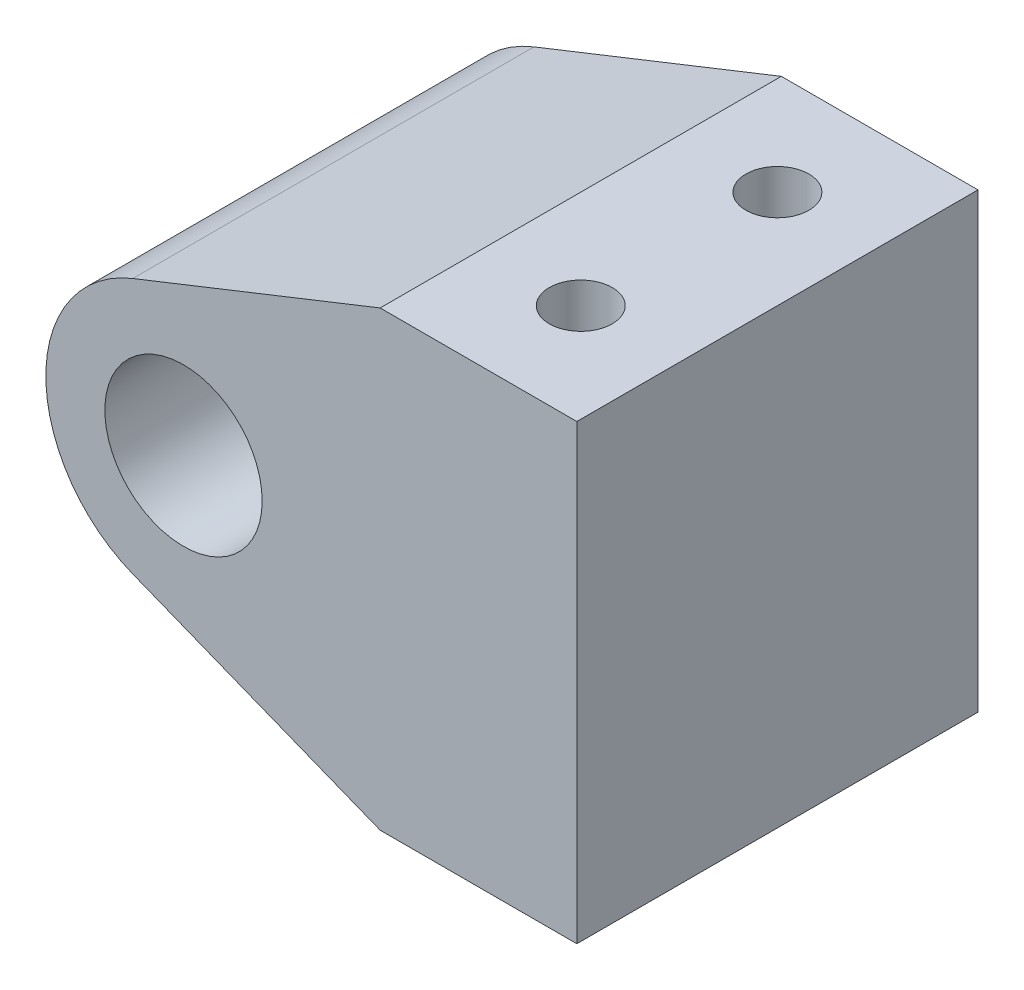
ISO-10303-21;
HEADER;
FILE_DESCRIPTION(('STEP AP214'),'2;1');
FILE_NAME('part.step','',(''),(''),'','','');
FILE_SCHEMA(('AUTOMOTIVE_DESIGN { 1 0 10303 214 1 1 1 1 }'));
ENDSEC;
DATA;
#1=APPLICATION_CONTEXT('core data for automotive mechanical design processes');
#2=APPLICATION_PROTOCOL_DEFINITION('international standard','automotive_design',2000,#1);
#3=PRODUCT_CONTEXT('',#1,'mechanical');
#4=PRODUCT('Part','Part','',(#3));
#5=PRODUCT_RELATED_PRODUCT_CATEGORY('part','',(#4));
#6=PRODUCT_DEFINITION_FORMATION('','',#4);
#7=PRODUCT_DEFINITION_CONTEXT('part definition',#1,'design');
#8=PRODUCT_DEFINITION('design','',#6,#7);
#9=PRODUCT_DEFINITION_SHAPE('','',#8);
#10=(LENGTH_UNIT() NAMED_UNIT(*) SI_UNIT(.MILLI.,.METRE.));
#11=(NAMED_UNIT(*) PLANE_ANGLE_UNIT() SI_UNIT($,.RADIAN.));
#12=(NAMED_UNIT(*) SI_UNIT($,.STERADIAN.) SOLID_ANGLE_UNIT());
#13=UNCERTAINTY_MEASURE_WITH_UNIT(LENGTH_MEASURE(1.E-05),#10,'distance_accuracy_value','');
#14=(GEOMETRIC_REPRESENTATION_CONTEXT(3) GLOBAL_UNCERTAINTY_ASSIGNED_CONTEXT((#13)) GLOBAL_UNIT_ASSIGNED_CONTEXT((#10,
#11,#12)) REPRESENTATION_CONTEXT('',''));
#15=CARTESIAN_POINT('',(0.,0.,0.));
#16=DIRECTION('',(0.,0.,1.));
#17=DIRECTION('',(1.,0.,0.));
#18=AXIS2_PLACEMENT_3D('',#15,#16,#17);
#19=CARTESIAN_POINT('',(-20.,11.5,20.4));
#20=DIRECTION('',(0.,0.,1.));
#21=DIRECTION('',(1.,0.,0.));
#22=AXIS2_PLACEMENT_3D('',#19,#20,#21);
#23=PLANE('',#22);
#24=DIRECTION('',(0.,1.,0.));
#25=VECTOR('',#24,1.);
#26=CARTESIAN_POINT('',(0.,0.,20.4));
#27=LINE('',#26,#25);
#28=CARTESIAN_POINT('',(0.,0.,20.4));
#29=VERTEX_POINT('',#28);
#30=CARTESIAN_POINT('',(0.,23.,20.4));
#31=VERTEX_POINT('',#30);
#32=EDGE_CURVE('E152',#29,#31,#27,.T.);
#33=ORIENTED_EDGE('',*,*,#32,.T.);
#34=DIRECTION('',(-1.,0.,0.));
#35=VECTOR('',#34,1.);
#36=CARTESIAN_POINT('',(0.,23.,20.4));
#37=LINE('',#36,#35);
#38=CARTESIAN_POINT('',(-10.,23.,20.4));
#39=VERTEX_POINT('',#38);
#40=EDGE_CURVE('E100',#31,#39,#37,.T.);
#41=ORIENTED_EDGE('',*,*,#40,.T.);
#42=DIRECTION('',(-0.929471964291965,-0.36889275893576,0.));
#43=VECTOR('',#42,1.);
#44=CARTESIAN_POINT('',(-22.5822493125503,18.0063037500437,20.4));
#45=LINE('',#44,#43);
#46=CARTESIAN_POINT('',(-22.5822493125503,18.0063037500437,20.4));
#47=VERTEX_POINT('',#46);
#48=EDGE_CURVE('E113',#39,#47,#45,.T.);
#49=ORIENTED_EDGE('',*,*,#48,.T.);
#50=CARTESIAN_POINT('',(-20.,11.5,20.4));
#51=DIRECTION('',(0.,0.,1.));
#52=DIRECTION('',(1.,0.,0.));
#53=AXIS2_PLACEMENT_3D('',#50,#51,#52);
#54=CIRCLE('',#53,7.);
#55=CARTESIAN_POINT('',(-22.5822493125503,4.99369624995625,20.4));
#56=VERTEX_POINT('',#55);
#57=EDGE_CURVE('E107',#47,#56,#54,.T.);
#58=ORIENTED_EDGE('',*,*,#57,.T.);
#59=DIRECTION('',(0.929471964291965,-0.36889275893576,0.));
#60=VECTOR('',#59,1.);
#61=CARTESIAN_POINT('',(-22.5822493125503,4.99369624995625,20.4));
#62=LINE('',#61,#60);
#63=CARTESIAN_POINT('',(-10.,0.,20.4));
#64=VERTEX_POINT('',#63);
#65=EDGE_CURVE('E111',#56,#64,#62,.T.);
#66=ORIENTED_EDGE('',*,*,#65,.T.);
#67=DIRECTION('',(1.,0.,0.));
#68=VECTOR('',#67,1.);
#69=CARTESIAN_POINT('',(0.,0.,20.4));
#70=LINE('',#69,#68);
#71=EDGE_CURVE('E63',#64,#29,#70,.T.);
#72=ORIENTED_EDGE('',*,*,#71,.T.);
#73=EDGE_LOOP('',(#33,#41,#49,#58,#66,#72));
#74=FACE_BOUND('',#73,.T.);
#75=CARTESIAN_POINT('',(-20.,11.5,20.4));
#76=DIRECTION('',(0.,0.,1.));
#77=DIRECTION('',(1.,0.,0.));
#78=AXIS2_PLACEMENT_3D('',#75,#76,#77);
#79=CIRCLE('',#78,4.);
#80=CARTESIAN_POINT('',(-16.,11.5,20.4));
#81=VERTEX_POINT('',#80);
#82=EDGE_CURVE('E140',#81,#81,#79,.T.);
#83=ORIENTED_EDGE('',*,*,#82,.F.);
#84=EDGE_LOOP('',(#83));
#85=FACE_BOUND('',#84,.T.);
#86=ADVANCED_FACE('F45',(#74,#85),#23,.T.);
#87=CARTESIAN_POINT('',(-20.,11.5,0.));
#88=DIRECTION('',(0.,0.,1.));
#89=DIRECTION('',(1.,0.,0.));
#90=AXIS2_PLACEMENT_3D('',#87,#88,#89);
#91=PLANE('',#90);
#92=DIRECTION('',(0.,1.,0.));
#93=VECTOR('',#92,1.);
#94=CARTESIAN_POINT('',(0.,0.,0.));
#95=LINE('',#94,#93);
#96=CARTESIAN_POINT('',(0.,0.,0.));
#97=VERTEX_POINT('',#96);
#98=CARTESIAN_POINT('',(0.,23.,0.));
#99=VERTEX_POINT('',#98);
#100=EDGE_CURVE('E135',#97,#99,#95,.T.);
#101=ORIENTED_EDGE('',*,*,#100,.F.);
#102=DIRECTION('',(1.,0.,0.));
#103=VECTOR('',#102,1.);
#104=CARTESIAN_POINT('',(0.,0.,0.));
#105=LINE('',#104,#103);
#106=CARTESIAN_POINT('',(-10.,0.,0.));
#107=VERTEX_POINT('',#106);
#108=EDGE_CURVE('E92',#107,#97,#105,.T.);
#109=ORIENTED_EDGE('',*,*,#108,.F.);
#110=DIRECTION('',(0.929471964291965,-0.36889275893576,0.));
#111=VECTOR('',#110,1.);
#112=CARTESIAN_POINT('',(-22.5822493125503,4.99369624995625,0.));
#113=LINE('',#112,#111);
#114=CARTESIAN_POINT('',(-22.5822493125503,4.99369624995625,0.));
#115=VERTEX_POINT('',#114);
#116=EDGE_CURVE('E86',#115,#107,#113,.T.);
#117=ORIENTED_EDGE('',*,*,#116,.F.);
#118=CARTESIAN_POINT('',(-20.,11.5,0.));
#119=DIRECTION('',(0.,0.,1.));
#120=DIRECTION('',(1.,0.,0.));
#121=AXIS2_PLACEMENT_3D('',#118,#119,#120);
#122=CIRCLE('',#121,7.);
#123=CARTESIAN_POINT('',(-22.5822493125503,18.0063037500437,0.));
#124=VERTEX_POINT('',#123);
#125=EDGE_CURVE('E122',#124,#115,#122,.T.);
#126=ORIENTED_EDGE('',*,*,#125,.F.);
#127=DIRECTION('',(-0.929471964291965,-0.36889275893576,0.));
#128=VECTOR('',#127,1.);
#129=CARTESIAN_POINT('',(-22.5822493125503,18.0063037500437,0.));
#130=LINE('',#129,#128);
#131=CARTESIAN_POINT('',(-10.,23.,0.));
#132=VERTEX_POINT('',#131);
#133=EDGE_CURVE('E143',#132,#124,#130,.T.);
#134=ORIENTED_EDGE('',*,*,#133,.F.);
#135=DIRECTION('',(-1.,0.,0.));
#136=VECTOR('',#135,1.);
#137=CARTESIAN_POINT('',(0.,23.,0.));
#138=LINE('',#137,#136);
#139=EDGE_CURVE('E139',#99,#132,#138,.T.);
#140=ORIENTED_EDGE('',*,*,#139,.F.);
#141=EDGE_LOOP('',(#101,#109,#117,#126,#134,#140));
#142=FACE_BOUND('',#141,.T.);
#143=CARTESIAN_POINT('',(-20.,11.5,0.));
#144=DIRECTION('',(0.,0.,1.));
#145=DIRECTION('',(1.,0.,0.));
#146=AXIS2_PLACEMENT_3D('',#143,#144,#145);
#147=CIRCLE('',#146,4.);
#148=CARTESIAN_POINT('',(-16.,11.5,0.));
#149=VERTEX_POINT('',#148);
#150=EDGE_CURVE('E213',#149,#149,#147,.T.);
#151=ORIENTED_EDGE('',*,*,#150,.T.);
#152=EDGE_LOOP('',(#151));
#153=FACE_BOUND('',#152,.T.);
#154=ADVANCED_FACE('F165',(#142,#153),#91,.F.);
#155=CARTESIAN_POINT('',(0.,0.,20.4));
#156=DIRECTION('',(-1.,0.,0.));
#157=DIRECTION('',(0.,0.,1.));
#158=AXIS2_PLACEMENT_3D('',#155,#156,#157);
#159=PLANE('',#158);
#160=ORIENTED_EDGE('',*,*,#100,.T.);
#161=DIRECTION('',(0.,0.,-1.));
#162=VECTOR('',#161,1.);
#163=CARTESIAN_POINT('',(0.,23.,20.4));
#164=LINE('',#163,#162);
#165=EDGE_CURVE('E11',#31,#99,#164,.T.);
#166=ORIENTED_EDGE('',*,*,#165,.F.);
#167=ORIENTED_EDGE('',*,*,#32,.F.);
#168=DIRECTION('',(0.,0.,-1.));
#169=VECTOR('',#168,1.);
#170=CARTESIAN_POINT('',(0.,0.,20.4));
#171=LINE('',#170,#169);
#172=EDGE_CURVE('E131',#29,#97,#171,.T.);
#173=ORIENTED_EDGE('',*,*,#172,.T.);
#174=EDGE_LOOP('',(#160,#166,#167,#173));
#175=FACE_BOUND('',#174,.T.);
#176=ADVANCED_FACE('F47',(#175),#159,.F.);
#177=CARTESIAN_POINT('',(0.,23.,20.4));
#178=DIRECTION('',(0.,-1.,0.));
#179=DIRECTION('',(1.,0.,0.));
#180=AXIS2_PLACEMENT_3D('',#177,#178,#179);
#181=PLANE('',#180);
#182=CARTESIAN_POINT('',(-5.,23.,5.2));
#183=DIRECTION('',(0.,1.,0.));
#184=DIRECTION('',(-1.,0.,0.));
#185=AXIS2_PLACEMENT_3D('',#182,#183,#184);
#186=CIRCLE('',#185,1.6);
#187=CARTESIAN_POINT('',(-6.6,23.,5.2));
#188=VERTEX_POINT('',#187);
#189=EDGE_CURVE('E206',#188,#188,#186,.T.);
#190=ORIENTED_EDGE('',*,*,#189,.F.);
#191=EDGE_LOOP('',(#190));
#192=FACE_BOUND('',#191,.T.);
#193=CARTESIAN_POINT('',(-5.,23.,15.2));
#194=DIRECTION('',(0.,1.,0.));
#195=DIRECTION('',(-1.,0.,0.));
#196=AXIS2_PLACEMENT_3D('',#193,#194,#195);
#197=CIRCLE('',#196,1.6);
#198=CARTESIAN_POINT('',(-6.6,23.,15.2));
#199=VERTEX_POINT('',#198);
#200=EDGE_CURVE('E209',#199,#199,#197,.T.);
#201=ORIENTED_EDGE('',*,*,#200,.F.);
#202=EDGE_LOOP('',(#201));
#203=FACE_BOUND('',#202,.T.);
#204=ORIENTED_EDGE('',*,*,#139,.T.);
#205=DIRECTION('',(0.,0.,-1.));
#206=VECTOR('',#205,1.);
#207=CARTESIAN_POINT('',(-10.,23.,20.4));
#208=LINE('',#207,#206);
#209=EDGE_CURVE('E55',#39,#132,#208,.T.);
#210=ORIENTED_EDGE('',*,*,#209,.F.);
#211=ORIENTED_EDGE('',*,*,#40,.F.);
#212=ORIENTED_EDGE('',*,*,#165,.T.);
#213=EDGE_LOOP('',(#204,#210,#211,#212));
#214=FACE_BOUND('',#213,.T.);
#215=ADVANCED_FACE('F239',(#192,#203,#214),#181,.F.);
#216=CARTESIAN_POINT('',(-22.5822493125503,18.0063037500437,20.4));
#217=DIRECTION('',(0.36889275893576,-0.929471964291965,0.));
#218=DIRECTION('',(0.929471964291965,0.36889275893576,0.));
#219=AXIS2_PLACEMENT_3D('',#216,#217,#218);
#220=PLANE('',#219);
#221=ORIENTED_EDGE('',*,*,#133,.T.);
#222=DIRECTION('',(0.,0.,-1.));
#223=VECTOR('',#222,1.);
#224=CARTESIAN_POINT('',(-22.5822493125503,18.0063037500437,20.4));
#225=LINE('',#224,#223);
#226=EDGE_CURVE('E124',#47,#124,#225,.T.);
#227=ORIENTED_EDGE('',*,*,#226,.F.);
#228=ORIENTED_EDGE('',*,*,#48,.F.);
#229=ORIENTED_EDGE('',*,*,#209,.T.);
#230=EDGE_LOOP('',(#221,#227,#228,#229));
#231=FACE_BOUND('',#230,.T.);
#232=ADVANCED_FACE('F162',(#231),#220,.F.);
#233=CARTESIAN_POINT('',(-20.,11.5,20.4));
#234=DIRECTION('',(0.,0.,-1.));
#235=DIRECTION('',(-1.,0.,0.));
#236=AXIS2_PLACEMENT_3D('',#233,#234,#235);
#237=CYLINDRICAL_SURFACE('',#236,7.);
#238=ORIENTED_EDGE('',*,*,#125,.T.);
#239=DIRECTION('',(0.,0.,-1.));
#240=VECTOR('',#239,1.);
#241=CARTESIAN_POINT('',(-22.5822493125503,4.99369624995625,20.4));
#242=LINE('',#241,#240);
#243=EDGE_CURVE('E119',#56,#115,#242,.T.);
#244=ORIENTED_EDGE('',*,*,#243,.F.);
#245=ORIENTED_EDGE('',*,*,#57,.F.);
#246=ORIENTED_EDGE('',*,*,#226,.T.);
#247=EDGE_LOOP('',(#238,#244,#245,#246));
#248=FACE_BOUND('',#247,.T.);
#249=ADVANCED_FACE('F120',(#248),#237,.T.);
#250=CARTESIAN_POINT('',(-22.5822493125503,4.99369624995625,20.4));
#251=DIRECTION('',(0.36889275893576,0.929471964291965,0.));
#252=DIRECTION('',(-0.929471964291965,0.36889275893576,0.));
#253=AXIS2_PLACEMENT_3D('',#250,#251,#252);
#254=PLANE('',#253);
#255=ORIENTED_EDGE('',*,*,#116,.T.);
#256=DIRECTION('',(0.,0.,-1.));
#257=VECTOR('',#256,1.);
#258=CARTESIAN_POINT('',(-10.,0.,20.4));
#259=LINE('',#258,#257);
#260=EDGE_CURVE('E125',#64,#107,#259,.T.);
#261=ORIENTED_EDGE('',*,*,#260,.F.);
#262=ORIENTED_EDGE('',*,*,#65,.F.);
#263=ORIENTED_EDGE('',*,*,#243,.T.);
#264=EDGE_LOOP('',(#255,#261,#262,#263));
#265=FACE_BOUND('',#264,.T.);
#266=ADVANCED_FACE('F127',(#265),#254,.F.);
#267=CARTESIAN_POINT('',(0.,0.,20.4));
#268=DIRECTION('',(0.,1.,0.));
#269=DIRECTION('',(-1.,0.,0.));
#270=AXIS2_PLACEMENT_3D('',#267,#268,#269);
#271=PLANE('',#270);
#272=CARTESIAN_POINT('',(-4.99999999999999,0.,5.2));
#273=DIRECTION('',(0.,1.,0.));
#274=DIRECTION('',(-1.,0.,0.));
#275=AXIS2_PLACEMENT_3D('',#272,#273,#274);
#276=CIRCLE('',#275,1.6);
#277=CARTESIAN_POINT('',(-6.59999999999999,0.,5.2));
#278=VERTEX_POINT('',#277);
#279=EDGE_CURVE('E203',#278,#278,#276,.T.);
#280=ORIENTED_EDGE('',*,*,#279,.T.);
#281=EDGE_LOOP('',(#280));
#282=FACE_BOUND('',#281,.T.);
#283=CARTESIAN_POINT('',(-4.99999999999999,0.,15.2));
#284=DIRECTION('',(0.,1.,0.));
#285=DIRECTION('',(-1.,0.,0.));
#286=AXIS2_PLACEMENT_3D('',#283,#284,#285);
#287=CIRCLE('',#286,1.6);
#288=CARTESIAN_POINT('',(-6.59999999999999,0.,15.2));
#289=VERTEX_POINT('',#288);
#290=EDGE_CURVE('E216',#289,#289,#287,.T.);
#291=ORIENTED_EDGE('',*,*,#290,.T.);
#292=EDGE_LOOP('',(#291));
#293=FACE_BOUND('',#292,.T.);
#294=ORIENTED_EDGE('',*,*,#108,.T.);
#295=ORIENTED_EDGE('',*,*,#172,.F.);
#296=ORIENTED_EDGE('',*,*,#71,.F.);
#297=ORIENTED_EDGE('',*,*,#260,.T.);
#298=EDGE_LOOP('',(#294,#295,#296,#297));
#299=FACE_BOUND('',#298,.T.);
#300=ADVANCED_FACE('F170',(#282,#293,#299),#271,.F.);
#301=CARTESIAN_POINT('',(-20.,11.5,20.4));
#302=DIRECTION('',(0.,0.,-1.));
#303=DIRECTION('',(-1.,0.,0.));
#304=AXIS2_PLACEMENT_3D('',#301,#302,#303);
#305=CYLINDRICAL_SURFACE('',#304,4.);
#306=ORIENTED_EDGE('',*,*,#82,.T.);
#307=EDGE_LOOP('',(#306));
#308=FACE_BOUND('',#307,.T.);
#309=ORIENTED_EDGE('',*,*,#150,.F.);
#310=EDGE_LOOP('',(#309));
#311=FACE_BOUND('',#310,.T.);
#312=ADVANCED_FACE('F172',(#308,#311),#305,.F.);
#313=CARTESIAN_POINT('',(-4.99999999999999,0.,15.2));
#314=DIRECTION('',(0.,1.,0.));
#315=DIRECTION('',(-1.,0.,0.));
#316=AXIS2_PLACEMENT_3D('',#313,#314,#315);
#317=CYLINDRICAL_SURFACE('',#316,1.6);
#318=ORIENTED_EDGE('',*,*,#290,.F.);
#319=EDGE_LOOP('',(#318));
#320=FACE_BOUND('',#319,.T.);
#321=ORIENTED_EDGE('',*,*,#200,.T.);
#322=EDGE_LOOP('',(#321));
#323=FACE_BOUND('',#322,.T.);
#324=ADVANCED_FACE('F180',(#320,#323),#317,.F.);
#325=CARTESIAN_POINT('',(-4.99999999999999,0.,5.2));
#326=DIRECTION('',(0.,1.,0.));
#327=DIRECTION('',(-1.,0.,0.));
#328=AXIS2_PLACEMENT_3D('',#325,#326,#327);
#329=CYLINDRICAL_SURFACE('',#328,1.6);
#330=ORIENTED_EDGE('',*,*,#279,.F.);
#331=EDGE_LOOP('',(#330));
#332=FACE_BOUND('',#331,.T.);
#333=ORIENTED_EDGE('',*,*,#189,.T.);
#334=EDGE_LOOP('',(#333));
#335=FACE_BOUND('',#334,.T.);
#336=ADVANCED_FACE('F195',(#332,#335),#329,.F.);
#337=CLOSED_SHELL('',(#86,#154,#176,#215,#232,#249,#266,#300,#312,#324,#336));
#338=MANIFOLD_SOLID_BREP('B2',#337);
#339=ADVANCED_BREP_SHAPE_REPRESENTATION('',(#18,#338),#14);
#340=SHAPE_DEFINITION_REPRESENTATION(#9,#339);
ENDSEC;
END-ISO-10303-21;
